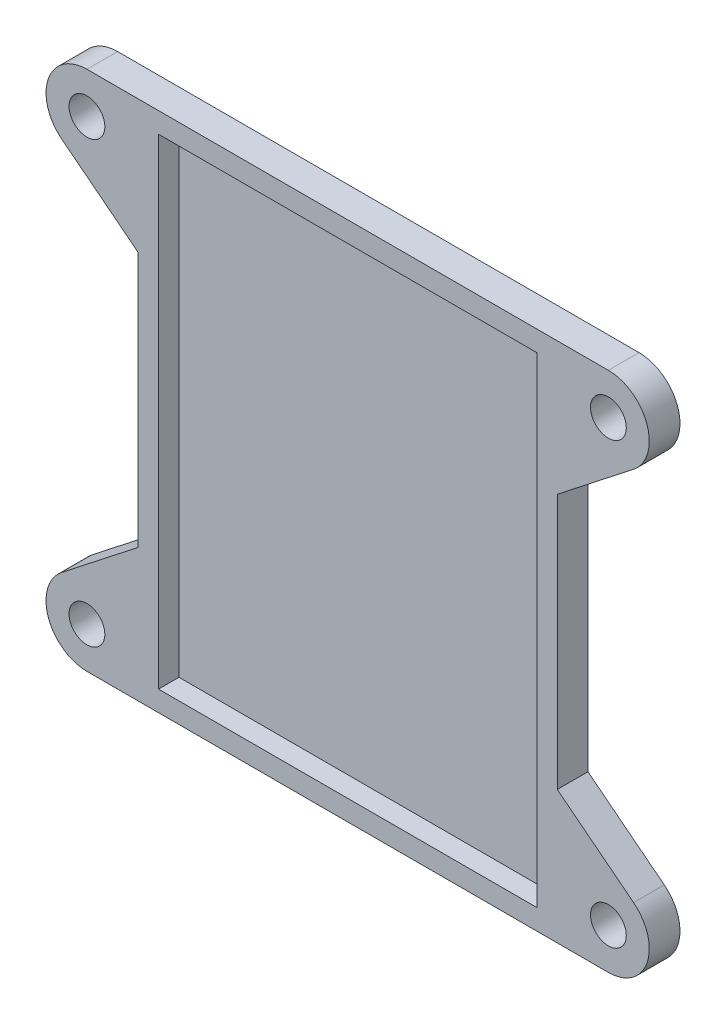
ISO-10303-21;
HEADER;
FILE_DESCRIPTION(('STEP AP214'),'2;1');
FILE_NAME('part.step','',(''),(''),'','','');
FILE_SCHEMA(('AUTOMOTIVE_DESIGN { 1 0 10303 214 1 1 1 1 }'));
ENDSEC;
DATA;
#1=APPLICATION_CONTEXT('core data for automotive mechanical design processes');
#2=APPLICATION_PROTOCOL_DEFINITION('international standard','automotive_design',2000,#1);
#3=PRODUCT_CONTEXT('',#1,'mechanical');
#4=PRODUCT('Part','Part','',(#3));
#5=PRODUCT_RELATED_PRODUCT_CATEGORY('part','',(#4));
#6=PRODUCT_DEFINITION_FORMATION('','',#4);
#7=PRODUCT_DEFINITION_CONTEXT('part definition',#1,'design');
#8=PRODUCT_DEFINITION('design','',#6,#7);
#9=PRODUCT_DEFINITION_SHAPE('','',#8);
#10=(LENGTH_UNIT() NAMED_UNIT(*) SI_UNIT(.MILLI.,.METRE.));
#11=(NAMED_UNIT(*) PLANE_ANGLE_UNIT() SI_UNIT($,.RADIAN.));
#12=(NAMED_UNIT(*) SI_UNIT($,.STERADIAN.) SOLID_ANGLE_UNIT());
#13=UNCERTAINTY_MEASURE_WITH_UNIT(LENGTH_MEASURE(1.E-05),#10,'distance_accuracy_value','');
#14=(GEOMETRIC_REPRESENTATION_CONTEXT(3) GLOBAL_UNCERTAINTY_ASSIGNED_CONTEXT((#13)) GLOBAL_UNIT_ASSIGNED_CONTEXT((#10,
#11,#12)) REPRESENTATION_CONTEXT('',''));
#15=CARTESIAN_POINT('',(0.,0.,0.));
#16=DIRECTION('',(0.,0.,1.));
#17=DIRECTION('',(1.,0.,0.));
#18=AXIS2_PLACEMENT_3D('',#15,#16,#17);
#19=CARTESIAN_POINT('',(-20.5,-25.5,3.));
#20=DIRECTION('',(1.,0.,0.));
#21=DIRECTION('',(0.,0.,-1.));
#22=AXIS2_PLACEMENT_3D('',#19,#20,#21);
#23=PLANE('',#22);
#24=DIRECTION('',(0.,0.,-1.));
#25=VECTOR('',#24,1.);
#26=CARTESIAN_POINT('',(-20.5,-12.5,3.));
#27=LINE('',#26,#25);
#28=CARTESIAN_POINT('',(-20.5,-12.5,3.));
#29=VERTEX_POINT('',#28);
#30=CARTESIAN_POINT('',(-20.5,-12.5,0.));
#31=VERTEX_POINT('',#30);
#32=EDGE_CURVE('E54',#29,#31,#27,.T.);
#33=ORIENTED_EDGE('',*,*,#32,.F.);
#34=DIRECTION('',(0.,-1.,0.));
#35=VECTOR('',#34,1.);
#36=CARTESIAN_POINT('',(-20.5,-25.5,3.));
#37=LINE('',#36,#35);
#38=CARTESIAN_POINT('',(-20.5,12.5,3.));
#39=VERTEX_POINT('',#38);
#40=EDGE_CURVE('E46',#39,#29,#37,.T.);
#41=ORIENTED_EDGE('',*,*,#40,.F.);
#42=DIRECTION('',(0.,0.,-1.));
#43=VECTOR('',#42,1.);
#44=CARTESIAN_POINT('',(-20.5,12.5,3.));
#45=LINE('',#44,#43);
#46=CARTESIAN_POINT('',(-20.5,12.5,0.));
#47=VERTEX_POINT('',#46);
#48=EDGE_CURVE('E201',#39,#47,#45,.T.);
#49=ORIENTED_EDGE('',*,*,#48,.T.);
#50=DIRECTION('',(0.,-1.,0.));
#51=VECTOR('',#50,1.);
#52=CARTESIAN_POINT('',(-20.5,-25.5,0.));
#53=LINE('',#52,#51);
#54=EDGE_CURVE('E59',#47,#31,#53,.T.);
#55=ORIENTED_EDGE('',*,*,#54,.T.);
#56=EDGE_LOOP('',(#33,#41,#49,#55));
#57=FACE_BOUND('',#56,.T.);
#58=ADVANCED_FACE('F37',(#57),#23,.F.);
#59=CARTESIAN_POINT('',(20.5,-25.5,3.));
#60=DIRECTION('',(-1.,0.,0.));
#61=DIRECTION('',(0.,0.,1.));
#62=AXIS2_PLACEMENT_3D('',#59,#60,#61);
#63=PLANE('',#62);
#64=DIRECTION('',(0.,1.,0.));
#65=VECTOR('',#64,1.);
#66=CARTESIAN_POINT('',(20.5,-25.5,3.));
#67=LINE('',#66,#65);
#68=CARTESIAN_POINT('',(20.5,-12.5,3.));
#69=VERTEX_POINT('',#68);
#70=CARTESIAN_POINT('',(20.5,12.5,3.));
#71=VERTEX_POINT('',#70);
#72=EDGE_CURVE('E286',#69,#71,#67,.T.);
#73=ORIENTED_EDGE('',*,*,#72,.F.);
#74=DIRECTION('',(0.,0.,-1.));
#75=VECTOR('',#74,1.);
#76=CARTESIAN_POINT('',(20.5,-12.5,3.));
#77=LINE('',#76,#75);
#78=CARTESIAN_POINT('',(20.5,-12.5,0.));
#79=VERTEX_POINT('',#78);
#80=EDGE_CURVE('E223',#69,#79,#77,.T.);
#81=ORIENTED_EDGE('',*,*,#80,.T.);
#82=DIRECTION('',(0.,1.,0.));
#83=VECTOR('',#82,1.);
#84=CARTESIAN_POINT('',(20.5,-25.5,0.));
#85=LINE('',#84,#83);
#86=CARTESIAN_POINT('',(20.5,12.5,0.));
#87=VERTEX_POINT('',#86);
#88=EDGE_CURVE('E279',#79,#87,#85,.T.);
#89=ORIENTED_EDGE('',*,*,#88,.T.);
#90=DIRECTION('',(0.,0.,-1.));
#91=VECTOR('',#90,1.);
#92=CARTESIAN_POINT('',(20.5,12.5,3.));
#93=LINE('',#92,#91);
#94=EDGE_CURVE('E247',#71,#87,#93,.T.);
#95=ORIENTED_EDGE('',*,*,#94,.F.);
#96=EDGE_LOOP('',(#73,#81,#89,#95));
#97=FACE_BOUND('',#96,.T.);
#98=ADVANCED_FACE('F39',(#97),#63,.F.);
#99=CARTESIAN_POINT('',(-20.5,25.5,3.));
#100=DIRECTION('',(0.,-1.,0.));
#101=DIRECTION('',(0.,0.,-1.));
#102=AXIS2_PLACEMENT_3D('',#99,#100,#101);
#103=PLANE('',#102);
#104=DIRECTION('',(-1.,0.,0.));
#105=VECTOR('',#104,1.);
#106=CARTESIAN_POINT('',(-20.5,25.5,0.));
#107=LINE('',#106,#105);
#108=CARTESIAN_POINT('',(25.5,25.5,0.));
#109=VERTEX_POINT('',#108);
#110=CARTESIAN_POINT('',(-25.5,25.5,0.));
#111=VERTEX_POINT('',#110);
#112=EDGE_CURVE('E292',#109,#111,#107,.T.);
#113=ORIENTED_EDGE('',*,*,#112,.T.);
#114=DIRECTION('',(0.,0.,-1.));
#115=VECTOR('',#114,1.);
#116=CARTESIAN_POINT('',(-25.5,25.5,3.));
#117=LINE('',#116,#115);
#118=CARTESIAN_POINT('',(-25.5,25.5,3.));
#119=VERTEX_POINT('',#118);
#120=EDGE_CURVE('E194',#119,#111,#117,.T.);
#121=ORIENTED_EDGE('',*,*,#120,.F.);
#122=DIRECTION('',(-1.,0.,0.));
#123=VECTOR('',#122,1.);
#124=CARTESIAN_POINT('',(-20.5,25.5,3.));
#125=LINE('',#124,#123);
#126=CARTESIAN_POINT('',(25.5,25.5,3.));
#127=VERTEX_POINT('',#126);
#128=EDGE_CURVE('E288',#127,#119,#125,.T.);
#129=ORIENTED_EDGE('',*,*,#128,.F.);
#130=DIRECTION('',(0.,0.,-1.));
#131=VECTOR('',#130,1.);
#132=CARTESIAN_POINT('',(25.5,25.5,3.));
#133=LINE('',#132,#131);
#134=EDGE_CURVE('E250',#127,#109,#133,.T.);
#135=ORIENTED_EDGE('',*,*,#134,.T.);
#136=EDGE_LOOP('',(#113,#121,#129,#135));
#137=FACE_BOUND('',#136,.T.);
#138=ADVANCED_FACE('F320',(#137),#103,.F.);
#139=CARTESIAN_POINT('',(-20.5,-25.5,3.));
#140=DIRECTION('',(0.,1.,0.));
#141=DIRECTION('',(0.,0.,1.));
#142=AXIS2_PLACEMENT_3D('',#139,#140,#141);
#143=PLANE('',#142);
#144=DIRECTION('',(1.,0.,0.));
#145=VECTOR('',#144,1.);
#146=CARTESIAN_POINT('',(-20.5,-25.5,0.));
#147=LINE('',#146,#145);
#148=CARTESIAN_POINT('',(-25.5,-25.5,0.));
#149=VERTEX_POINT('',#148);
#150=CARTESIAN_POINT('',(25.5,-25.5,0.));
#151=VERTEX_POINT('',#150);
#152=EDGE_CURVE('E41',#149,#151,#147,.T.);
#153=ORIENTED_EDGE('',*,*,#152,.T.);
#154=DIRECTION('',(0.,0.,-1.));
#155=VECTOR('',#154,1.);
#156=CARTESIAN_POINT('',(25.5,-25.5,3.));
#157=LINE('',#156,#155);
#158=CARTESIAN_POINT('',(25.5,-25.5,3.));
#159=VERTEX_POINT('',#158);
#160=EDGE_CURVE('E157',#159,#151,#157,.T.);
#161=ORIENTED_EDGE('',*,*,#160,.F.);
#162=DIRECTION('',(1.,0.,0.));
#163=VECTOR('',#162,1.);
#164=CARTESIAN_POINT('',(-20.5,-25.5,3.));
#165=LINE('',#164,#163);
#166=CARTESIAN_POINT('',(-25.5,-25.5,3.));
#167=VERTEX_POINT('',#166);
#168=EDGE_CURVE('E11',#167,#159,#165,.T.);
#169=ORIENTED_EDGE('',*,*,#168,.F.);
#170=DIRECTION('',(0.,0.,-1.));
#171=VECTOR('',#170,1.);
#172=CARTESIAN_POINT('',(-25.5,-25.5,3.));
#173=LINE('',#172,#171);
#174=EDGE_CURVE('E154',#167,#149,#173,.T.);
#175=ORIENTED_EDGE('',*,*,#174,.T.);
#176=EDGE_LOOP('',(#153,#161,#169,#175));
#177=FACE_BOUND('',#176,.T.);
#178=ADVANCED_FACE('F152',(#177),#143,.F.);
#179=CARTESIAN_POINT('',(0.,0.,3.));
#180=DIRECTION('',(0.,0.,-1.));
#181=DIRECTION('',(-1.,0.,0.));
#182=AXIS2_PLACEMENT_3D('',#179,#180,#181);
#183=PLANE('',#182);
#184=DIRECTION('',(0.,1.,0.));
#185=VECTOR('',#184,1.);
#186=CARTESIAN_POINT('',(18.5,-23.5,3.));
#187=LINE('',#186,#185);
#188=CARTESIAN_POINT('',(18.5,-23.5,3.));
#189=VERTEX_POINT('',#188);
#190=CARTESIAN_POINT('',(18.5,23.5,3.));
#191=VERTEX_POINT('',#190);
#192=EDGE_CURVE('E269',#189,#191,#187,.T.);
#193=ORIENTED_EDGE('',*,*,#192,.F.);
#194=DIRECTION('',(1.,0.,0.));
#195=VECTOR('',#194,1.);
#196=CARTESIAN_POINT('',(-18.5,-23.5,3.));
#197=LINE('',#196,#195);
#198=CARTESIAN_POINT('',(-18.5,-23.5,3.));
#199=VERTEX_POINT('',#198);
#200=EDGE_CURVE('E253',#199,#189,#197,.T.);
#201=ORIENTED_EDGE('',*,*,#200,.F.);
#202=DIRECTION('',(0.,-1.,0.));
#203=VECTOR('',#202,1.);
#204=CARTESIAN_POINT('',(-18.5,23.5,3.));
#205=LINE('',#204,#203);
#206=CARTESIAN_POINT('',(-18.5,23.5,3.));
#207=VERTEX_POINT('',#206);
#208=EDGE_CURVE('E258',#207,#199,#205,.T.);
#209=ORIENTED_EDGE('',*,*,#208,.F.);
#210=DIRECTION('',(-1.,0.,0.));
#211=VECTOR('',#210,1.);
#212=CARTESIAN_POINT('',(18.5,23.5,3.));
#213=LINE('',#212,#211);
#214=EDGE_CURVE('E272',#191,#207,#213,.T.);
#215=ORIENTED_EDGE('',*,*,#214,.F.);
#216=EDGE_LOOP('',(#193,#201,#209,#215));
#217=FACE_BOUND('',#216,.T.);
#218=ORIENTED_EDGE('',*,*,#168,.T.);
#219=CARTESIAN_POINT('',(25.5,-21.5,3.));
#220=DIRECTION('',(0.,0.,-1.));
#221=DIRECTION('',(1.,0.,0.));
#222=AXIS2_PLACEMENT_3D('',#219,#220,#221);
#223=CIRCLE('',#222,4.);
#224=CARTESIAN_POINT('',(27.9672262952659,-18.3515409470745,3.));
#225=VERTEX_POINT('',#224);
#226=EDGE_CURVE('E212',#225,#159,#223,.T.);
#227=ORIENTED_EDGE('',*,*,#226,.F.);
#228=DIRECTION('',(0.787114763231374,-0.616806573816474,0.));
#229=VECTOR('',#228,1.);
#230=CARTESIAN_POINT('',(20.5,-12.5,3.));
#231=LINE('',#230,#229);
#232=EDGE_CURVE('E214',#69,#225,#231,.T.);
#233=ORIENTED_EDGE('',*,*,#232,.F.);
#234=ORIENTED_EDGE('',*,*,#72,.T.);
#235=DIRECTION('',(0.787114763231374,0.616806573816474,0.));
#236=VECTOR('',#235,1.);
#237=CARTESIAN_POINT('',(20.5,12.5,3.));
#238=LINE('',#237,#236);
#239=CARTESIAN_POINT('',(27.9672262952659,18.3515409470745,3.));
#240=VERTEX_POINT('',#239);
#241=EDGE_CURVE('E238',#71,#240,#238,.T.);
#242=ORIENTED_EDGE('',*,*,#241,.T.);
#243=CARTESIAN_POINT('',(25.5,21.5,3.));
#244=DIRECTION('',(0.,0.,1.));
#245=DIRECTION('',(1.,0.,0.));
#246=AXIS2_PLACEMENT_3D('',#243,#244,#245);
#247=CIRCLE('',#246,4.);
#248=EDGE_CURVE('E235',#240,#127,#247,.T.);
#249=ORIENTED_EDGE('',*,*,#248,.T.);
#250=ORIENTED_EDGE('',*,*,#128,.T.);
#251=CARTESIAN_POINT('',(-25.5,21.5,3.));
#252=DIRECTION('',(0.,0.,-1.));
#253=DIRECTION('',(-1.,0.,0.));
#254=AXIS2_PLACEMENT_3D('',#251,#252,#253);
#255=CIRCLE('',#254,4.);
#256=CARTESIAN_POINT('',(-27.9672262952659,18.3515409470745,3.));
#257=VERTEX_POINT('',#256);
#258=EDGE_CURVE('E187',#257,#119,#255,.T.);
#259=ORIENTED_EDGE('',*,*,#258,.F.);
#260=DIRECTION('',(-0.787114763231374,0.616806573816474,0.));
#261=VECTOR('',#260,1.);
#262=CARTESIAN_POINT('',(-20.5,12.5,3.));
#263=LINE('',#262,#261);
#264=EDGE_CURVE('E190',#39,#257,#263,.T.);
#265=ORIENTED_EDGE('',*,*,#264,.F.);
#266=ORIENTED_EDGE('',*,*,#40,.T.);
#267=DIRECTION('',(-0.787114763231374,-0.616806573816474,0.));
#268=VECTOR('',#267,1.);
#269=CARTESIAN_POINT('',(-20.5,-12.5,3.));
#270=LINE('',#269,#268);
#271=CARTESIAN_POINT('',(-27.9672262952659,-18.3515409470745,3.));
#272=VERTEX_POINT('',#271);
#273=EDGE_CURVE('E166',#29,#272,#270,.T.);
#274=ORIENTED_EDGE('',*,*,#273,.T.);
#275=CARTESIAN_POINT('',(-25.5,-21.5,3.));
#276=DIRECTION('',(0.,0.,1.));
#277=DIRECTION('',(-1.,0.,0.));
#278=AXIS2_PLACEMENT_3D('',#275,#276,#277);
#279=CIRCLE('',#278,4.);
#280=EDGE_CURVE('E162',#272,#167,#279,.T.);
#281=ORIENTED_EDGE('',*,*,#280,.T.);
#282=EDGE_LOOP('',(#218,#227,#233,#234,#242,#249,#250,#259,#265,#266,#274,#281));
#283=FACE_BOUND('',#282,.T.);
#284=CARTESIAN_POINT('',(25.5,21.5,3.));
#285=DIRECTION('',(0.,0.,1.));
#286=DIRECTION('',(1.,0.,0.));
#287=AXIS2_PLACEMENT_3D('',#284,#285,#286);
#288=CIRCLE('',#287,1.75);
#289=CARTESIAN_POINT('',(27.25,21.5,3.));
#290=VERTEX_POINT('',#289);
#291=EDGE_CURVE('E229',#290,#290,#288,.T.);
#292=ORIENTED_EDGE('',*,*,#291,.F.);
#293=EDGE_LOOP('',(#292));
#294=FACE_BOUND('',#293,.T.);
#295=CARTESIAN_POINT('',(25.5,-21.5,3.));
#296=DIRECTION('',(0.,0.,-1.));
#297=DIRECTION('',(1.,0.,0.));
#298=AXIS2_PLACEMENT_3D('',#295,#296,#297);
#299=CIRCLE('',#298,1.75);
#300=CARTESIAN_POINT('',(27.25,-21.5,3.));
#301=VERTEX_POINT('',#300);
#302=EDGE_CURVE('E206',#301,#301,#299,.T.);
#303=ORIENTED_EDGE('',*,*,#302,.T.);
#304=EDGE_LOOP('',(#303));
#305=FACE_BOUND('',#304,.T.);
#306=CARTESIAN_POINT('',(-25.5,21.5,3.));
#307=DIRECTION('',(0.,0.,-1.));
#308=DIRECTION('',(-1.,0.,0.));
#309=AXIS2_PLACEMENT_3D('',#306,#307,#308);
#310=CIRCLE('',#309,1.75);
#311=CARTESIAN_POINT('',(-27.25,21.5,3.));
#312=VERTEX_POINT('',#311);
#313=EDGE_CURVE('E178',#312,#312,#310,.T.);
#314=ORIENTED_EDGE('',*,*,#313,.T.);
#315=EDGE_LOOP('',(#314));
#316=FACE_BOUND('',#315,.T.);
#317=CARTESIAN_POINT('',(-25.5,-21.5,3.));
#318=DIRECTION('',(0.,0.,1.));
#319=DIRECTION('',(-1.,0.,0.));
#320=AXIS2_PLACEMENT_3D('',#317,#318,#319);
#321=CIRCLE('',#320,1.75);
#322=CARTESIAN_POINT('',(-27.25,-21.5,3.));
#323=VERTEX_POINT('',#322);
#324=EDGE_CURVE('E329',#323,#323,#321,.T.);
#325=ORIENTED_EDGE('',*,*,#324,.F.);
#326=EDGE_LOOP('',(#325));
#327=FACE_BOUND('',#326,.T.);
#328=ADVANCED_FACE('F163',(#217,#283,#294,#305,#316,#327),#183,.F.);
#329=CARTESIAN_POINT('',(0.,0.,0.));
#330=DIRECTION('',(0.,0.,-1.));
#331=DIRECTION('',(-1.,0.,0.));
#332=AXIS2_PLACEMENT_3D('',#329,#330,#331);
#333=PLANE('',#332);
#334=ORIENTED_EDGE('',*,*,#88,.F.);
#335=DIRECTION('',(0.787114763231374,-0.616806573816474,0.));
#336=VECTOR('',#335,1.);
#337=CARTESIAN_POINT('',(20.5,-12.5,0.));
#338=LINE('',#337,#336);
#339=CARTESIAN_POINT('',(27.9672262952659,-18.3515409470745,0.));
#340=VERTEX_POINT('',#339);
#341=EDGE_CURVE('E215',#79,#340,#338,.T.);
#342=ORIENTED_EDGE('',*,*,#341,.T.);
#343=CARTESIAN_POINT('',(25.5,-21.5,0.));
#344=DIRECTION('',(0.,0.,-1.));
#345=DIRECTION('',(1.,0.,0.));
#346=AXIS2_PLACEMENT_3D('',#343,#344,#345);
#347=CIRCLE('',#346,4.);
#348=EDGE_CURVE('E209',#340,#151,#347,.T.);
#349=ORIENTED_EDGE('',*,*,#348,.T.);
#350=ORIENTED_EDGE('',*,*,#152,.F.);
#351=CARTESIAN_POINT('',(-25.5,-21.5,0.));
#352=DIRECTION('',(0.,0.,1.));
#353=DIRECTION('',(-1.,0.,0.));
#354=AXIS2_PLACEMENT_3D('',#351,#352,#353);
#355=CIRCLE('',#354,4.);
#356=CARTESIAN_POINT('',(-27.9672262952659,-18.3515409470745,0.));
#357=VERTEX_POINT('',#356);
#358=EDGE_CURVE('E174',#357,#149,#355,.T.);
#359=ORIENTED_EDGE('',*,*,#358,.F.);
#360=DIRECTION('',(-0.787114763231374,-0.616806573816474,0.));
#361=VECTOR('',#360,1.);
#362=CARTESIAN_POINT('',(-20.5,-12.5,0.));
#363=LINE('',#362,#361);
#364=EDGE_CURVE('E170',#31,#357,#363,.T.);
#365=ORIENTED_EDGE('',*,*,#364,.F.);
#366=ORIENTED_EDGE('',*,*,#54,.F.);
#367=DIRECTION('',(-0.787114763231374,0.616806573816474,0.));
#368=VECTOR('',#367,1.);
#369=CARTESIAN_POINT('',(-20.5,12.5,0.));
#370=LINE('',#369,#368);
#371=CARTESIAN_POINT('',(-27.9672262952659,18.3515409470745,0.));
#372=VERTEX_POINT('',#371);
#373=EDGE_CURVE('E191',#47,#372,#370,.T.);
#374=ORIENTED_EDGE('',*,*,#373,.T.);
#375=CARTESIAN_POINT('',(-25.5,21.5,0.));
#376=DIRECTION('',(0.,0.,-1.));
#377=DIRECTION('',(-1.,0.,0.));
#378=AXIS2_PLACEMENT_3D('',#375,#376,#377);
#379=CIRCLE('',#378,4.);
#380=EDGE_CURVE('E185',#372,#111,#379,.T.);
#381=ORIENTED_EDGE('',*,*,#380,.T.);
#382=ORIENTED_EDGE('',*,*,#112,.F.);
#383=CARTESIAN_POINT('',(25.5,21.5,0.));
#384=DIRECTION('',(0.,0.,1.));
#385=DIRECTION('',(1.,0.,0.));
#386=AXIS2_PLACEMENT_3D('',#383,#384,#385);
#387=CIRCLE('',#386,4.);
#388=CARTESIAN_POINT('',(27.9672262952659,18.3515409470745,0.));
#389=VERTEX_POINT('',#388);
#390=EDGE_CURVE('E232',#389,#109,#387,.T.);
#391=ORIENTED_EDGE('',*,*,#390,.F.);
#392=DIRECTION('',(0.787114763231374,0.616806573816474,0.));
#393=VECTOR('',#392,1.);
#394=CARTESIAN_POINT('',(20.5,12.5,0.));
#395=LINE('',#394,#393);
#396=EDGE_CURVE('E239',#87,#389,#395,.T.);
#397=ORIENTED_EDGE('',*,*,#396,.F.);
#398=EDGE_LOOP('',(#334,#342,#349,#350,#359,#365,#366,#374,#381,#382,#391,#397));
#399=FACE_BOUND('',#398,.T.);
#400=CARTESIAN_POINT('',(25.5,21.5,0.));
#401=DIRECTION('',(0.,0.,1.));
#402=DIRECTION('',(1.,0.,0.));
#403=AXIS2_PLACEMENT_3D('',#400,#401,#402);
#404=CIRCLE('',#403,1.75);
#405=CARTESIAN_POINT('',(27.25,21.5,0.));
#406=VERTEX_POINT('',#405);
#407=EDGE_CURVE('E228',#406,#406,#404,.T.);
#408=ORIENTED_EDGE('',*,*,#407,.T.);
#409=EDGE_LOOP('',(#408));
#410=FACE_BOUND('',#409,.T.);
#411=CARTESIAN_POINT('',(25.5,-21.5,0.));
#412=DIRECTION('',(0.,0.,-1.));
#413=DIRECTION('',(1.,0.,0.));
#414=AXIS2_PLACEMENT_3D('',#411,#412,#413);
#415=CIRCLE('',#414,1.75);
#416=CARTESIAN_POINT('',(27.25,-21.5,0.));
#417=VERTEX_POINT('',#416);
#418=EDGE_CURVE('E205',#417,#417,#415,.T.);
#419=ORIENTED_EDGE('',*,*,#418,.F.);
#420=EDGE_LOOP('',(#419));
#421=FACE_BOUND('',#420,.T.);
#422=CARTESIAN_POINT('',(-25.5,21.5,0.));
#423=DIRECTION('',(0.,0.,-1.));
#424=DIRECTION('',(-1.,0.,0.));
#425=AXIS2_PLACEMENT_3D('',#422,#423,#424);
#426=CIRCLE('',#425,1.75);
#427=CARTESIAN_POINT('',(-27.25,21.5,0.));
#428=VERTEX_POINT('',#427);
#429=EDGE_CURVE('E175',#428,#428,#426,.T.);
#430=ORIENTED_EDGE('',*,*,#429,.F.);
#431=EDGE_LOOP('',(#430));
#432=FACE_BOUND('',#431,.T.);
#433=CARTESIAN_POINT('',(-25.5,-21.5,0.));
#434=DIRECTION('',(0.,0.,1.));
#435=DIRECTION('',(-1.,0.,0.));
#436=AXIS2_PLACEMENT_3D('',#433,#434,#435);
#437=CIRCLE('',#436,1.75);
#438=CARTESIAN_POINT('',(-27.25,-21.5,0.));
#439=VERTEX_POINT('',#438);
#440=EDGE_CURVE('E333',#439,#439,#437,.T.);
#441=ORIENTED_EDGE('',*,*,#440,.T.);
#442=EDGE_LOOP('',(#441));
#443=FACE_BOUND('',#442,.T.);
#444=ADVANCED_FACE('F297',(#399,#410,#421,#432,#443),#333,.T.);
#445=CARTESIAN_POINT('',(-18.5,-23.5,1.));
#446=DIRECTION('',(0.,-1.,0.));
#447=DIRECTION('',(0.,0.,-1.));
#448=AXIS2_PLACEMENT_3D('',#445,#446,#447);
#449=PLANE('',#448);
#450=ORIENTED_EDGE('',*,*,#200,.T.);
#451=DIRECTION('',(0.,0.,1.));
#452=VECTOR('',#451,1.);
#453=CARTESIAN_POINT('',(18.5,-23.5,1.));
#454=LINE('',#453,#452);
#455=CARTESIAN_POINT('',(18.5,-23.5,1.));
#456=VERTEX_POINT('',#455);
#457=EDGE_CURVE('E267',#456,#189,#454,.T.);
#458=ORIENTED_EDGE('',*,*,#457,.F.);
#459=DIRECTION('',(1.,0.,0.));
#460=VECTOR('',#459,1.);
#461=CARTESIAN_POINT('',(-18.5,-23.5,1.));
#462=LINE('',#461,#460);
#463=CARTESIAN_POINT('',(-18.5,-23.5,1.));
#464=VERTEX_POINT('',#463);
#465=EDGE_CURVE('E254',#464,#456,#462,.T.);
#466=ORIENTED_EDGE('',*,*,#465,.F.);
#467=DIRECTION('',(0.,0.,1.));
#468=VECTOR('',#467,1.);
#469=CARTESIAN_POINT('',(-18.5,-23.5,1.));
#470=LINE('',#469,#468);
#471=EDGE_CURVE('E277',#464,#199,#470,.T.);
#472=ORIENTED_EDGE('',*,*,#471,.T.);
#473=EDGE_LOOP('',(#450,#458,#466,#472));
#474=FACE_BOUND('',#473,.T.);
#475=ADVANCED_FACE('F349',(#474),#449,.F.);
#476=CARTESIAN_POINT('',(-18.5,23.5,1.));
#477=DIRECTION('',(-1.,0.,0.));
#478=DIRECTION('',(0.,0.,1.));
#479=AXIS2_PLACEMENT_3D('',#476,#477,#478);
#480=PLANE('',#479);
#481=ORIENTED_EDGE('',*,*,#208,.T.);
#482=ORIENTED_EDGE('',*,*,#471,.F.);
#483=DIRECTION('',(0.,-1.,0.));
#484=VECTOR('',#483,1.);
#485=CARTESIAN_POINT('',(-18.5,23.5,1.));
#486=LINE('',#485,#484);
#487=CARTESIAN_POINT('',(-18.5,23.5,1.));
#488=VERTEX_POINT('',#487);
#489=EDGE_CURVE('E264',#488,#464,#486,.T.);
#490=ORIENTED_EDGE('',*,*,#489,.F.);
#491=DIRECTION('',(0.,0.,1.));
#492=VECTOR('',#491,1.);
#493=CARTESIAN_POINT('',(-18.5,23.5,1.));
#494=LINE('',#493,#492);
#495=EDGE_CURVE('E280',#488,#207,#494,.T.);
#496=ORIENTED_EDGE('',*,*,#495,.T.);
#497=EDGE_LOOP('',(#481,#482,#490,#496));
#498=FACE_BOUND('',#497,.T.);
#499=ADVANCED_FACE('F549',(#498),#480,.F.);
#500=CARTESIAN_POINT('',(18.5,23.5,1.));
#501=DIRECTION('',(0.,1.,0.));
#502=DIRECTION('',(0.,0.,1.));
#503=AXIS2_PLACEMENT_3D('',#500,#501,#502);
#504=PLANE('',#503);
#505=ORIENTED_EDGE('',*,*,#214,.T.);
#506=ORIENTED_EDGE('',*,*,#495,.F.);
#507=DIRECTION('',(-1.,0.,0.));
#508=VECTOR('',#507,1.);
#509=CARTESIAN_POINT('',(18.5,23.5,1.));
#510=LINE('',#509,#508);
#511=CARTESIAN_POINT('',(18.5,23.5,1.));
#512=VERTEX_POINT('',#511);
#513=EDGE_CURVE('E261',#512,#488,#510,.T.);
#514=ORIENTED_EDGE('',*,*,#513,.F.);
#515=DIRECTION('',(0.,0.,1.));
#516=VECTOR('',#515,1.);
#517=CARTESIAN_POINT('',(18.5,23.5,1.));
#518=LINE('',#517,#516);
#519=EDGE_CURVE('E282',#512,#191,#518,.T.);
#520=ORIENTED_EDGE('',*,*,#519,.T.);
#521=EDGE_LOOP('',(#505,#506,#514,#520));
#522=FACE_BOUND('',#521,.T.);
#523=ADVANCED_FACE('F539',(#522),#504,.F.);
#524=CARTESIAN_POINT('',(18.5,-23.5,1.));
#525=DIRECTION('',(1.,0.,0.));
#526=DIRECTION('',(0.,0.,-1.));
#527=AXIS2_PLACEMENT_3D('',#524,#525,#526);
#528=PLANE('',#527);
#529=ORIENTED_EDGE('',*,*,#192,.T.);
#530=ORIENTED_EDGE('',*,*,#519,.F.);
#531=DIRECTION('',(0.,1.,0.));
#532=VECTOR('',#531,1.);
#533=CARTESIAN_POINT('',(18.5,-23.5,1.));
#534=LINE('',#533,#532);
#535=EDGE_CURVE('E257',#456,#512,#534,.T.);
#536=ORIENTED_EDGE('',*,*,#535,.F.);
#537=ORIENTED_EDGE('',*,*,#457,.T.);
#538=EDGE_LOOP('',(#529,#530,#536,#537));
#539=FACE_BOUND('',#538,.T.);
#540=ADVANCED_FACE('F529',(#539),#528,.F.);
#541=CARTESIAN_POINT('',(0.,0.,1.));
#542=DIRECTION('',(0.,0.,1.));
#543=DIRECTION('',(1.,0.,0.));
#544=AXIS2_PLACEMENT_3D('',#541,#542,#543);
#545=PLANE('',#544);
#546=ORIENTED_EDGE('',*,*,#465,.T.);
#547=ORIENTED_EDGE('',*,*,#535,.T.);
#548=ORIENTED_EDGE('',*,*,#513,.T.);
#549=ORIENTED_EDGE('',*,*,#489,.T.);
#550=EDGE_LOOP('',(#546,#547,#548,#549));
#551=FACE_BOUND('',#550,.T.);
#552=ADVANCED_FACE('F512',(#551),#545,.T.);
#553=CARTESIAN_POINT('',(25.5,21.5,3.));
#554=DIRECTION('',(0.,0.,-1.));
#555=DIRECTION('',(-1.,0.,0.));
#556=AXIS2_PLACEMENT_3D('',#553,#554,#555);
#557=CYLINDRICAL_SURFACE('',#556,4.);
#558=ORIENTED_EDGE('',*,*,#390,.T.);
#559=ORIENTED_EDGE('',*,*,#134,.F.);
#560=ORIENTED_EDGE('',*,*,#248,.F.);
#561=DIRECTION('',(0.,0.,-1.));
#562=VECTOR('',#561,1.);
#563=CARTESIAN_POINT('',(27.9672262952659,18.3515409470745,3.));
#564=LINE('',#563,#562);
#565=EDGE_CURVE('E241',#240,#389,#564,.T.);
#566=ORIENTED_EDGE('',*,*,#565,.T.);
#567=EDGE_LOOP('',(#558,#559,#560,#566));
#568=FACE_BOUND('',#567,.T.);
#569=ADVANCED_FACE('F315',(#568),#557,.T.);
#570=CARTESIAN_POINT('',(20.5,12.5,3.));
#571=DIRECTION('',(-0.616806573816474,0.787114763231374,0.));
#572=DIRECTION('',(-0.787114763231375,-0.616806573816474,0.));
#573=AXIS2_PLACEMENT_3D('',#570,#571,#572);
#574=PLANE('',#573);
#575=ORIENTED_EDGE('',*,*,#396,.T.);
#576=ORIENTED_EDGE('',*,*,#565,.F.);
#577=ORIENTED_EDGE('',*,*,#241,.F.);
#578=ORIENTED_EDGE('',*,*,#94,.T.);
#579=EDGE_LOOP('',(#575,#576,#577,#578));
#580=FACE_BOUND('',#579,.T.);
#581=ADVANCED_FACE('F310',(#580),#574,.F.);
#582=CARTESIAN_POINT('',(25.5,21.5,3.));
#583=DIRECTION('',(0.,0.,-1.));
#584=DIRECTION('',(-1.,0.,0.));
#585=AXIS2_PLACEMENT_3D('',#582,#583,#584);
#586=CYLINDRICAL_SURFACE('',#585,1.75);
#587=ORIENTED_EDGE('',*,*,#291,.T.);
#588=EDGE_LOOP('',(#587));
#589=FACE_BOUND('',#588,.T.);
#590=ORIENTED_EDGE('',*,*,#407,.F.);
#591=EDGE_LOOP('',(#590));
#592=FACE_BOUND('',#591,.T.);
#593=ADVANCED_FACE('F393',(#589,#592),#586,.F.);
#594=CARTESIAN_POINT('',(25.5,-21.5,3.));
#595=DIRECTION('',(0.,0.,-1.));
#596=DIRECTION('',(-1.,0.,0.));
#597=AXIS2_PLACEMENT_3D('',#594,#595,#596);
#598=CYLINDRICAL_SURFACE('',#597,4.);
#599=ORIENTED_EDGE('',*,*,#348,.F.);
#600=DIRECTION('',(0.,0.,-1.));
#601=VECTOR('',#600,1.);
#602=CARTESIAN_POINT('',(27.9672262952659,-18.3515409470745,3.));
#603=LINE('',#602,#601);
#604=EDGE_CURVE('E226',#225,#340,#603,.T.);
#605=ORIENTED_EDGE('',*,*,#604,.F.);
#606=ORIENTED_EDGE('',*,*,#226,.T.);
#607=ORIENTED_EDGE('',*,*,#160,.T.);
#608=EDGE_LOOP('',(#599,#605,#606,#607));
#609=FACE_BOUND('',#608,.T.);
#610=ADVANCED_FACE('F296',(#609),#598,.T.);
#611=CARTESIAN_POINT('',(20.5,-12.5,3.));
#612=DIRECTION('',(0.616806573816474,0.787114763231374,0.));
#613=DIRECTION('',(-0.787114763231375,0.616806573816474,0.));
#614=AXIS2_PLACEMENT_3D('',#611,#612,#613);
#615=PLANE('',#614);
#616=ORIENTED_EDGE('',*,*,#341,.F.);
#617=ORIENTED_EDGE('',*,*,#80,.F.);
#618=ORIENTED_EDGE('',*,*,#232,.T.);
#619=ORIENTED_EDGE('',*,*,#604,.T.);
#620=EDGE_LOOP('',(#616,#617,#618,#619));
#621=FACE_BOUND('',#620,.T.);
#622=ADVANCED_FACE('F303',(#621),#615,.T.);
#623=CARTESIAN_POINT('',(25.5,-21.5,3.));
#624=DIRECTION('',(0.,0.,-1.));
#625=DIRECTION('',(-1.,0.,0.));
#626=AXIS2_PLACEMENT_3D('',#623,#624,#625);
#627=CYLINDRICAL_SURFACE('',#626,1.75);
#628=ORIENTED_EDGE('',*,*,#302,.F.);
#629=EDGE_LOOP('',(#628));
#630=FACE_BOUND('',#629,.T.);
#631=ORIENTED_EDGE('',*,*,#418,.T.);
#632=EDGE_LOOP('',(#631));
#633=FACE_BOUND('',#632,.T.);
#634=ADVANCED_FACE('F404',(#630,#633),#627,.F.);
#635=CARTESIAN_POINT('',(-25.5,21.5,3.));
#636=DIRECTION('',(0.,0.,-1.));
#637=DIRECTION('',(-1.,0.,0.));
#638=AXIS2_PLACEMENT_3D('',#635,#636,#637);
#639=CYLINDRICAL_SURFACE('',#638,4.);
#640=ORIENTED_EDGE('',*,*,#380,.F.);
#641=DIRECTION('',(0.,0.,-1.));
#642=VECTOR('',#641,1.);
#643=CARTESIAN_POINT('',(-27.9672262952659,18.3515409470745,3.));
#644=LINE('',#643,#642);
#645=EDGE_CURVE('E203',#257,#372,#644,.T.);
#646=ORIENTED_EDGE('',*,*,#645,.F.);
#647=ORIENTED_EDGE('',*,*,#258,.T.);
#648=ORIENTED_EDGE('',*,*,#120,.T.);
#649=EDGE_LOOP('',(#640,#646,#647,#648));
#650=FACE_BOUND('',#649,.T.);
#651=ADVANCED_FACE('F323',(#650),#639,.T.);
#652=CARTESIAN_POINT('',(-20.5,12.5,3.));
#653=DIRECTION('',(-0.616806573816474,-0.787114763231374,0.));
#654=DIRECTION('',(0.787114763231375,-0.616806573816474,0.));
#655=AXIS2_PLACEMENT_3D('',#652,#653,#654);
#656=PLANE('',#655);
#657=ORIENTED_EDGE('',*,*,#373,.F.);
#658=ORIENTED_EDGE('',*,*,#48,.F.);
#659=ORIENTED_EDGE('',*,*,#264,.T.);
#660=ORIENTED_EDGE('',*,*,#645,.T.);
#661=EDGE_LOOP('',(#657,#658,#659,#660));
#662=FACE_BOUND('',#661,.T.);
#663=ADVANCED_FACE('F325',(#662),#656,.T.);
#664=CARTESIAN_POINT('',(-25.5,21.5,3.));
#665=DIRECTION('',(0.,0.,-1.));
#666=DIRECTION('',(-1.,0.,0.));
#667=AXIS2_PLACEMENT_3D('',#664,#665,#666);
#668=CYLINDRICAL_SURFACE('',#667,1.75);
#669=ORIENTED_EDGE('',*,*,#313,.F.);
#670=EDGE_LOOP('',(#669));
#671=FACE_BOUND('',#670,.T.);
#672=ORIENTED_EDGE('',*,*,#429,.T.);
#673=EDGE_LOOP('',(#672));
#674=FACE_BOUND('',#673,.T.);
#675=ADVANCED_FACE('F433',(#671,#674),#668,.F.);
#676=CARTESIAN_POINT('',(-25.5,-21.5,3.));
#677=DIRECTION('',(0.,0.,-1.));
#678=DIRECTION('',(-1.,0.,0.));
#679=AXIS2_PLACEMENT_3D('',#676,#677,#678);
#680=CYLINDRICAL_SURFACE('',#679,4.);
#681=ORIENTED_EDGE('',*,*,#358,.T.);
#682=ORIENTED_EDGE('',*,*,#174,.F.);
#683=ORIENTED_EDGE('',*,*,#280,.F.);
#684=DIRECTION('',(0.,0.,-1.));
#685=VECTOR('',#684,1.);
#686=CARTESIAN_POINT('',(-27.9672262952659,-18.3515409470745,3.));
#687=LINE('',#686,#685);
#688=EDGE_CURVE('E180',#272,#357,#687,.T.);
#689=ORIENTED_EDGE('',*,*,#688,.T.);
#690=EDGE_LOOP('',(#681,#682,#683,#689));
#691=FACE_BOUND('',#690,.T.);
#692=ADVANCED_FACE('F172',(#691),#680,.T.);
#693=CARTESIAN_POINT('',(-20.5,-12.5,3.));
#694=DIRECTION('',(0.616806573816474,-0.787114763231374,0.));
#695=DIRECTION('',(0.787114763231375,0.616806573816474,0.));
#696=AXIS2_PLACEMENT_3D('',#693,#694,#695);
#697=PLANE('',#696);
#698=ORIENTED_EDGE('',*,*,#364,.T.);
#699=ORIENTED_EDGE('',*,*,#688,.F.);
#700=ORIENTED_EDGE('',*,*,#273,.F.);
#701=ORIENTED_EDGE('',*,*,#32,.T.);
#702=EDGE_LOOP('',(#698,#699,#700,#701));
#703=FACE_BOUND('',#702,.T.);
#704=ADVANCED_FACE('F453',(#703),#697,.F.);
#705=CARTESIAN_POINT('',(-25.5,-21.5,3.));
#706=DIRECTION('',(0.,0.,-1.));
#707=DIRECTION('',(-1.,0.,0.));
#708=AXIS2_PLACEMENT_3D('',#705,#706,#707);
#709=CYLINDRICAL_SURFACE('',#708,1.75);
#710=ORIENTED_EDGE('',*,*,#324,.T.);
#711=EDGE_LOOP('',(#710));
#712=FACE_BOUND('',#711,.T.);
#713=ORIENTED_EDGE('',*,*,#440,.F.);
#714=EDGE_LOOP('',(#713));
#715=FACE_BOUND('',#714,.T.);
#716=ADVANCED_FACE('F339',(#712,#715),#709,.F.);
#717=CLOSED_SHELL('',(#58,#98,#138,#178,#328,#444,#475,#499,#523,#540,#552,#569,#581,#593,#610,
#622,#634,#651,#663,#675,#692,#704,#716));
#718=MANIFOLD_SOLID_BREP('B2',#717);
#719=ADVANCED_BREP_SHAPE_REPRESENTATION('',(#18,#718),#14);
#720=SHAPE_DEFINITION_REPRESENTATION(#9,#719);
ENDSEC;
END-ISO-10303-21;
